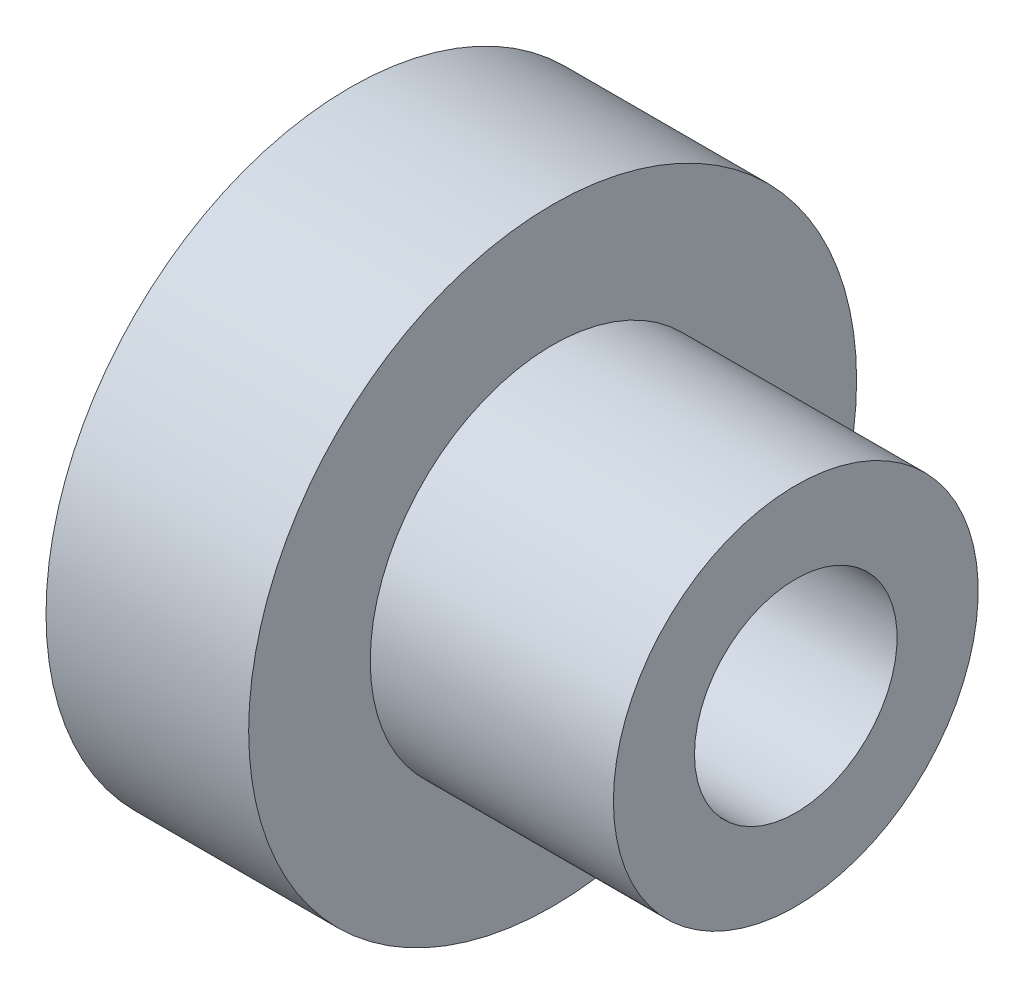
ISO-10303-21;
HEADER;
FILE_DESCRIPTION(('STEP AP214'),'2;1');
FILE_NAME('part.step','',(''),(''),'','','');
FILE_SCHEMA(('AUTOMOTIVE_DESIGN { 1 0 10303 214 1 1 1 1 }'));
ENDSEC;
DATA;
#1=APPLICATION_CONTEXT('core data for automotive mechanical design processes');
#2=APPLICATION_PROTOCOL_DEFINITION('international standard','automotive_design',2000,#1);
#3=PRODUCT_CONTEXT('',#1,'mechanical');
#4=PRODUCT('Part','Part','',(#3));
#5=PRODUCT_RELATED_PRODUCT_CATEGORY('part','',(#4));
#6=PRODUCT_DEFINITION_FORMATION('','',#4);
#7=PRODUCT_DEFINITION_CONTEXT('part definition',#1,'design');
#8=PRODUCT_DEFINITION('design','',#6,#7);
#9=PRODUCT_DEFINITION_SHAPE('','',#8);
#10=(LENGTH_UNIT() NAMED_UNIT(*) SI_UNIT(.MILLI.,.METRE.));
#11=(NAMED_UNIT(*) PLANE_ANGLE_UNIT() SI_UNIT($,.RADIAN.));
#12=(NAMED_UNIT(*) SI_UNIT($,.STERADIAN.) SOLID_ANGLE_UNIT());
#13=UNCERTAINTY_MEASURE_WITH_UNIT(LENGTH_MEASURE(1.E-05),#10,'distance_accuracy_value','');
#14=(GEOMETRIC_REPRESENTATION_CONTEXT(3) GLOBAL_UNCERTAINTY_ASSIGNED_CONTEXT((#13)) GLOBAL_UNIT_ASSIGNED_CONTEXT((#10,
#11,#12)) REPRESENTATION_CONTEXT('',''));
#15=CARTESIAN_POINT('',(0.,0.,0.));
#16=DIRECTION('',(0.,0.,1.));
#17=DIRECTION('',(1.,0.,0.));
#18=AXIS2_PLACEMENT_3D('',#15,#16,#17);
#19=CARTESIAN_POINT('',(0.,0.,0.));
#20=DIRECTION('',(-1.,0.,0.));
#21=DIRECTION('',(0.,0.,1.));
#22=AXIS2_PLACEMENT_3D('',#19,#20,#21);
#23=CYLINDRICAL_SURFACE('',#22,2.5);
#24=CARTESIAN_POINT('',(11.,0.,0.));
#25=DIRECTION('',(-1.,0.,0.));
#26=DIRECTION('',(0.,0.,1.));
#27=AXIS2_PLACEMENT_3D('',#24,#25,#26);
#28=CIRCLE('',#27,2.5);
#29=CARTESIAN_POINT('',(11.,0.,2.5));
#30=VERTEX_POINT('',#29);
#31=EDGE_CURVE('E52',#30,#30,#28,.T.);
#32=ORIENTED_EDGE('',*,*,#31,.F.);
#33=EDGE_LOOP('',(#32));
#34=FACE_BOUND('',#33,.T.);
#35=CARTESIAN_POINT('',(0.,0.,0.));
#36=DIRECTION('',(-1.,0.,0.));
#37=DIRECTION('',(0.,0.,1.));
#38=AXIS2_PLACEMENT_3D('',#35,#36,#37);
#39=CIRCLE('',#38,2.5);
#40=CARTESIAN_POINT('',(0.,0.,2.5));
#41=VERTEX_POINT('',#40);
#42=EDGE_CURVE('E10',#41,#41,#39,.T.);
#43=ORIENTED_EDGE('',*,*,#42,.T.);
#44=EDGE_LOOP('',(#43));
#45=FACE_BOUND('',#44,.T.);
#46=ADVANCED_FACE('F30',(#34,#45),#23,.F.);
#47=CARTESIAN_POINT('',(0.,2.5,0.));
#48=DIRECTION('',(1.,0.,0.));
#49=DIRECTION('',(0.,0.,-1.));
#50=AXIS2_PLACEMENT_3D('',#47,#48,#49);
#51=PLANE('',#50);
#52=ORIENTED_EDGE('',*,*,#42,.F.);
#53=EDGE_LOOP('',(#52));
#54=FACE_BOUND('',#53,.T.);
#55=CARTESIAN_POINT('',(0.,0.,0.));
#56=DIRECTION('',(-1.,0.,0.));
#57=DIRECTION('',(0.,0.,1.));
#58=AXIS2_PLACEMENT_3D('',#55,#56,#57);
#59=CIRCLE('',#58,7.5);
#60=CARTESIAN_POINT('',(0.,0.,7.5));
#61=VERTEX_POINT('',#60);
#62=EDGE_CURVE('E36',#61,#61,#59,.T.);
#63=ORIENTED_EDGE('',*,*,#62,.T.);
#64=EDGE_LOOP('',(#63));
#65=FACE_BOUND('',#64,.T.);
#66=ADVANCED_FACE('F59',(#54,#65),#51,.F.);
#67=CARTESIAN_POINT('',(0.,0.,0.));
#68=DIRECTION('',(-1.,0.,0.));
#69=DIRECTION('',(0.,0.,1.));
#70=AXIS2_PLACEMENT_3D('',#67,#68,#69);
#71=CYLINDRICAL_SURFACE('',#70,7.5);
#72=ORIENTED_EDGE('',*,*,#62,.F.);
#73=EDGE_LOOP('',(#72));
#74=FACE_BOUND('',#73,.T.);
#75=CARTESIAN_POINT('',(5.,0.,0.));
#76=DIRECTION('',(-1.,0.,0.));
#77=DIRECTION('',(0.,0.,1.));
#78=AXIS2_PLACEMENT_3D('',#75,#76,#77);
#79=CIRCLE('',#78,7.5);
#80=CARTESIAN_POINT('',(5.,0.,7.5));
#81=VERTEX_POINT('',#80);
#82=EDGE_CURVE('E40',#81,#81,#79,.T.);
#83=ORIENTED_EDGE('',*,*,#82,.T.);
#84=EDGE_LOOP('',(#83));
#85=FACE_BOUND('',#84,.T.);
#86=ADVANCED_FACE('F63',(#74,#85),#71,.T.);
#87=CARTESIAN_POINT('',(5.,7.5,0.));
#88=DIRECTION('',(-1.,0.,0.));
#89=DIRECTION('',(0.,0.,1.));
#90=AXIS2_PLACEMENT_3D('',#87,#88,#89);
#91=PLANE('',#90);
#92=ORIENTED_EDGE('',*,*,#82,.F.);
#93=EDGE_LOOP('',(#92));
#94=FACE_BOUND('',#93,.T.);
#95=CARTESIAN_POINT('',(5.,0.,0.));
#96=DIRECTION('',(-1.,0.,0.));
#97=DIRECTION('',(0.,0.,1.));
#98=AXIS2_PLACEMENT_3D('',#95,#96,#97);
#99=CIRCLE('',#98,4.5);
#100=CARTESIAN_POINT('',(5.,0.,4.5));
#101=VERTEX_POINT('',#100);
#102=EDGE_CURVE('E44',#101,#101,#99,.T.);
#103=ORIENTED_EDGE('',*,*,#102,.T.);
#104=EDGE_LOOP('',(#103));
#105=FACE_BOUND('',#104,.T.);
#106=ADVANCED_FACE('F68',(#94,#105),#91,.F.);
#107=CARTESIAN_POINT('',(0.,0.,0.));
#108=DIRECTION('',(-1.,0.,0.));
#109=DIRECTION('',(0.,0.,1.));
#110=AXIS2_PLACEMENT_3D('',#107,#108,#109);
#111=CYLINDRICAL_SURFACE('',#110,4.5);
#112=ORIENTED_EDGE('',*,*,#102,.F.);
#113=EDGE_LOOP('',(#112));
#114=FACE_BOUND('',#113,.T.);
#115=CARTESIAN_POINT('',(11.,0.,0.));
#116=DIRECTION('',(-1.,0.,0.));
#117=DIRECTION('',(0.,0.,1.));
#118=AXIS2_PLACEMENT_3D('',#115,#116,#117);
#119=CIRCLE('',#118,4.5);
#120=CARTESIAN_POINT('',(11.,0.,4.5));
#121=VERTEX_POINT('',#120);
#122=EDGE_CURVE('E49',#121,#121,#119,.T.);
#123=ORIENTED_EDGE('',*,*,#122,.T.);
#124=EDGE_LOOP('',(#123));
#125=FACE_BOUND('',#124,.T.);
#126=ADVANCED_FACE('F74',(#114,#125),#111,.T.);
#127=CARTESIAN_POINT('',(11.,4.5,0.));
#128=DIRECTION('',(-1.,0.,0.));
#129=DIRECTION('',(0.,0.,1.));
#130=AXIS2_PLACEMENT_3D('',#127,#128,#129);
#131=PLANE('',#130);
#132=ORIENTED_EDGE('',*,*,#122,.F.);
#133=EDGE_LOOP('',(#132));
#134=FACE_BOUND('',#133,.T.);
#135=ORIENTED_EDGE('',*,*,#31,.T.);
#136=EDGE_LOOP('',(#135));
#137=FACE_BOUND('',#136,.T.);
#138=ADVANCED_FACE('F56',(#134,#137),#131,.F.);
#139=CLOSED_SHELL('',(#46,#66,#86,#106,#126,#138));
#140=MANIFOLD_SOLID_BREP('B2',#139);
#141=ADVANCED_BREP_SHAPE_REPRESENTATION('',(#18,#140),#14);
#142=SHAPE_DEFINITION_REPRESENTATION(#9,#141);
ENDSEC;
END-ISO-10303-21;
